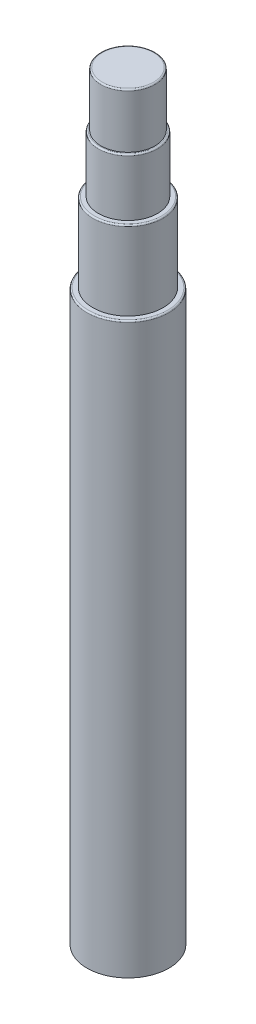
ISO-10303-21;
HEADER;
FILE_DESCRIPTION(('STEP AP214'),'2;1');
FILE_NAME('part.step','',(''),(''),'','','');
FILE_SCHEMA(('AUTOMOTIVE_DESIGN { 1 0 10303 214 1 1 1 1 }'));
ENDSEC;
DATA;
#1=APPLICATION_CONTEXT('core data for automotive mechanical design processes');
#2=APPLICATION_PROTOCOL_DEFINITION('international standard','automotive_design',2000,#1);
#3=PRODUCT_CONTEXT('',#1,'mechanical');
#4=PRODUCT('Part','Part','',(#3));
#5=PRODUCT_RELATED_PRODUCT_CATEGORY('part','',(#4));
#6=PRODUCT_DEFINITION_FORMATION('','',#4);
#7=PRODUCT_DEFINITION_CONTEXT('part definition',#1,'design');
#8=PRODUCT_DEFINITION('design','',#6,#7);
#9=PRODUCT_DEFINITION_SHAPE('','',#8);
#10=(LENGTH_UNIT() NAMED_UNIT(*) SI_UNIT(.MILLI.,.METRE.));
#11=(NAMED_UNIT(*) PLANE_ANGLE_UNIT() SI_UNIT($,.RADIAN.));
#12=(NAMED_UNIT(*) SI_UNIT($,.STERADIAN.) SOLID_ANGLE_UNIT());
#13=UNCERTAINTY_MEASURE_WITH_UNIT(LENGTH_MEASURE(1.E-05),#10,'distance_accuracy_value','');
#14=(GEOMETRIC_REPRESENTATION_CONTEXT(3) GLOBAL_UNCERTAINTY_ASSIGNED_CONTEXT((#13)) GLOBAL_UNIT_ASSIGNED_CONTEXT((#10,
#11,#12)) REPRESENTATION_CONTEXT('',''));
#15=CARTESIAN_POINT('',(0.,0.,0.));
#16=DIRECTION('',(0.,0.,1.));
#17=DIRECTION('',(1.,0.,0.));
#18=AXIS2_PLACEMENT_3D('',#15,#16,#17);
#19=CARTESIAN_POINT('',(0.,397.,0.));
#20=DIRECTION('',(0.,-1.,0.));
#21=DIRECTION('',(0.,0.,-1.));
#22=AXIS2_PLACEMENT_3D('',#19,#20,#21);
#23=CYLINDRICAL_SURFACE('',#22,28.575);
#24=CARTESIAN_POINT('',(0.,396.,0.));
#25=DIRECTION('',(0.,1.,0.));
#26=DIRECTION('',(0.,0.,1.));
#27=AXIS2_PLACEMENT_3D('',#24,#25,#26);
#28=CIRCLE('',#27,28.575);
#29=CARTESIAN_POINT('',(0.,396.,28.575));
#30=VERTEX_POINT('',#29);
#31=EDGE_CURVE('E79',#30,#30,#28,.F.);
#32=ORIENTED_EDGE('',*,*,#31,.T.);
#33=EDGE_LOOP('',(#32));
#34=FACE_BOUND('',#33,.T.);
#35=CARTESIAN_POINT('',(0.,0.,0.));
#36=DIRECTION('',(0.,1.,0.));
#37=DIRECTION('',(0.,0.,1.));
#38=AXIS2_PLACEMENT_3D('',#35,#36,#37);
#39=CIRCLE('',#38,28.575);
#40=CARTESIAN_POINT('',(0.,0.,28.575));
#41=VERTEX_POINT('',#40);
#42=EDGE_CURVE('E72',#41,#41,#39,.T.);
#43=ORIENTED_EDGE('',*,*,#42,.T.);
#44=EDGE_LOOP('',(#43));
#45=FACE_BOUND('',#44,.T.);
#46=ADVANCED_FACE('F41',(#34,#45),#23,.T.);
#47=CARTESIAN_POINT('',(0.,397.,0.));
#48=DIRECTION('',(0.,1.,0.));
#49=DIRECTION('',(0.,0.,1.));
#50=AXIS2_PLACEMENT_3D('',#47,#48,#49);
#51=PLANE('',#50);
#52=CARTESIAN_POINT('',(0.,397.,0.));
#53=DIRECTION('',(0.,1.,0.));
#54=DIRECTION('',(0.,0.,1.));
#55=AXIS2_PLACEMENT_3D('',#52,#53,#54);
#56=CIRCLE('',#55,27.575);
#57=CARTESIAN_POINT('',(0.,397.,27.575));
#58=VERTEX_POINT('',#57);
#59=EDGE_CURVE('E63',#58,#58,#56,.T.);
#60=ORIENTED_EDGE('',*,*,#59,.T.);
#61=EDGE_LOOP('',(#60));
#62=FACE_BOUND('',#61,.T.);
#63=CARTESIAN_POINT('',(0.,397.,0.));
#64=DIRECTION('',(0.,1.,0.));
#65=DIRECTION('',(0.,0.,1.));
#66=AXIS2_PLACEMENT_3D('',#63,#64,#65);
#67=CIRCLE('',#66,24.5);
#68=CARTESIAN_POINT('',(0.,397.,24.5));
#69=VERTEX_POINT('',#68);
#70=EDGE_CURVE('E68',#69,#69,#67,.T.);
#71=ORIENTED_EDGE('',*,*,#70,.F.);
#72=EDGE_LOOP('',(#71));
#73=FACE_BOUND('',#72,.T.);
#74=ADVANCED_FACE('F119',(#62,#73),#51,.T.);
#75=CARTESIAN_POINT('',(0.,0.,0.));
#76=DIRECTION('',(0.,1.,0.));
#77=DIRECTION('',(0.,0.,1.));
#78=AXIS2_PLACEMENT_3D('',#75,#76,#77);
#79=PLANE('',#78);
#80=CARTESIAN_POINT('',(0.,0.,0.));
#81=DIRECTION('',(0.,-1.,0.));
#82=DIRECTION('',(0.,0.,-1.));
#83=AXIS2_PLACEMENT_3D('',#80,#81,#82);
#84=CIRCLE('',#83,5.);
#85=CARTESIAN_POINT('',(0.,0.,-5.));
#86=VERTEX_POINT('',#85);
#87=EDGE_CURVE('E10',#86,#86,#84,.T.);
#88=ORIENTED_EDGE('',*,*,#87,.F.);
#89=EDGE_LOOP('',(#88));
#90=FACE_BOUND('',#89,.T.);
#91=ORIENTED_EDGE('',*,*,#42,.F.);
#92=EDGE_LOOP('',(#91));
#93=FACE_BOUND('',#92,.T.);
#94=ADVANCED_FACE('F125',(#90,#93),#79,.F.);
#95=CARTESIAN_POINT('',(0.,452.,0.));
#96=DIRECTION('',(0.,-1.,0.));
#97=DIRECTION('',(0.,0.,-1.));
#98=AXIS2_PLACEMENT_3D('',#95,#96,#97);
#99=CYLINDRICAL_SURFACE('',#98,24.5);
#100=CARTESIAN_POINT('',(0.,451.,0.));
#101=DIRECTION('',(0.,1.,0.));
#102=DIRECTION('',(0.,0.,1.));
#103=AXIS2_PLACEMENT_3D('',#100,#101,#102);
#104=CIRCLE('',#103,24.5);
#105=CARTESIAN_POINT('',(0.,451.,24.5));
#106=VERTEX_POINT('',#105);
#107=EDGE_CURVE('E87',#106,#106,#104,.F.);
#108=ORIENTED_EDGE('',*,*,#107,.T.);
#109=EDGE_LOOP('',(#108));
#110=FACE_BOUND('',#109,.T.);
#111=ORIENTED_EDGE('',*,*,#70,.T.);
#112=EDGE_LOOP('',(#111));
#113=FACE_BOUND('',#112,.T.);
#114=ADVANCED_FACE('F147',(#110,#113),#99,.T.);
#115=CARTESIAN_POINT('',(0.,452.,0.));
#116=DIRECTION('',(0.,1.,0.));
#117=DIRECTION('',(0.,0.,1.));
#118=AXIS2_PLACEMENT_3D('',#115,#116,#117);
#119=PLANE('',#118);
#120=CARTESIAN_POINT('',(0.,452.,0.));
#121=DIRECTION('',(0.,1.,0.));
#122=DIRECTION('',(0.,0.,1.));
#123=AXIS2_PLACEMENT_3D('',#120,#121,#122);
#124=CIRCLE('',#123,23.5);
#125=CARTESIAN_POINT('',(0.,452.,23.5));
#126=VERTEX_POINT('',#125);
#127=EDGE_CURVE('E83',#126,#126,#124,.T.);
#128=ORIENTED_EDGE('',*,*,#127,.T.);
#129=EDGE_LOOP('',(#128));
#130=FACE_BOUND('',#129,.T.);
#131=CARTESIAN_POINT('',(0.,452.,0.));
#132=DIRECTION('',(0.,1.,0.));
#133=DIRECTION('',(0.,0.,1.));
#134=AXIS2_PLACEMENT_3D('',#131,#132,#133);
#135=CIRCLE('',#134,20.64);
#136=CARTESIAN_POINT('',(0.,452.,20.64));
#137=VERTEX_POINT('',#136);
#138=EDGE_CURVE('E64',#137,#137,#135,.T.);
#139=ORIENTED_EDGE('',*,*,#138,.F.);
#140=EDGE_LOOP('',(#139));
#141=FACE_BOUND('',#140,.T.);
#142=ADVANCED_FACE('F143',(#130,#141),#119,.T.);
#143=CARTESIAN_POINT('',(0.,492.,0.));
#144=DIRECTION('',(0.,-1.,0.));
#145=DIRECTION('',(0.,0.,-1.));
#146=AXIS2_PLACEMENT_3D('',#143,#144,#145);
#147=CYLINDRICAL_SURFACE('',#146,20.64);
#148=CARTESIAN_POINT('',(0.,491.,0.));
#149=DIRECTION('',(0.,1.,0.));
#150=DIRECTION('',(0.,0.,1.));
#151=AXIS2_PLACEMENT_3D('',#148,#149,#150);
#152=CIRCLE('',#151,20.64);
#153=CARTESIAN_POINT('',(0.,491.,20.64));
#154=VERTEX_POINT('',#153);
#155=EDGE_CURVE('E95',#154,#154,#152,.F.);
#156=ORIENTED_EDGE('',*,*,#155,.T.);
#157=EDGE_LOOP('',(#156));
#158=FACE_BOUND('',#157,.T.);
#159=ORIENTED_EDGE('',*,*,#138,.T.);
#160=EDGE_LOOP('',(#159));
#161=FACE_BOUND('',#160,.T.);
#162=ADVANCED_FACE('F146',(#158,#161),#147,.T.);
#163=CARTESIAN_POINT('',(0.,492.,0.));
#164=DIRECTION('',(0.,1.,0.));
#165=DIRECTION('',(0.,0.,1.));
#166=AXIS2_PLACEMENT_3D('',#163,#164,#165);
#167=PLANE('',#166);
#168=CARTESIAN_POINT('',(0.,492.,0.));
#169=DIRECTION('',(0.,1.,0.));
#170=DIRECTION('',(0.,0.,1.));
#171=AXIS2_PLACEMENT_3D('',#168,#169,#170);
#172=CIRCLE('',#171,19.64);
#173=CARTESIAN_POINT('',(0.,492.,19.64));
#174=VERTEX_POINT('',#173);
#175=EDGE_CURVE('E91',#174,#174,#172,.T.);
#176=ORIENTED_EDGE('',*,*,#175,.T.);
#177=EDGE_LOOP('',(#176));
#178=FACE_BOUND('',#177,.T.);
#179=CARTESIAN_POINT('',(0.,492.,0.));
#180=DIRECTION('',(0.,1.,0.));
#181=DIRECTION('',(0.,0.,1.));
#182=AXIS2_PLACEMENT_3D('',#179,#180,#181);
#183=CIRCLE('',#182,18.9);
#184=CARTESIAN_POINT('',(0.,492.,18.9));
#185=VERTEX_POINT('',#184);
#186=EDGE_CURVE('E59',#185,#185,#183,.T.);
#187=ORIENTED_EDGE('',*,*,#186,.F.);
#188=EDGE_LOOP('',(#187));
#189=FACE_BOUND('',#188,.T.);
#190=ADVANCED_FACE('F152',(#178,#189),#167,.T.);
#191=CARTESIAN_POINT('',(0.,530.,0.));
#192=DIRECTION('',(0.,-1.,0.));
#193=DIRECTION('',(0.,0.,-1.));
#194=AXIS2_PLACEMENT_3D('',#191,#192,#193);
#195=CYLINDRICAL_SURFACE('',#194,18.9);
#196=CARTESIAN_POINT('',(0.,529.,0.));
#197=DIRECTION('',(0.,1.,0.));
#198=DIRECTION('',(0.,0.,1.));
#199=AXIS2_PLACEMENT_3D('',#196,#197,#198);
#200=CIRCLE('',#199,18.9);
#201=CARTESIAN_POINT('',(0.,529.,18.9));
#202=VERTEX_POINT('',#201);
#203=EDGE_CURVE('E45',#202,#202,#200,.F.);
#204=ORIENTED_EDGE('',*,*,#203,.T.);
#205=EDGE_LOOP('',(#204));
#206=FACE_BOUND('',#205,.T.);
#207=ORIENTED_EDGE('',*,*,#186,.T.);
#208=EDGE_LOOP('',(#207));
#209=FACE_BOUND('',#208,.T.);
#210=ADVANCED_FACE('F158',(#206,#209),#195,.T.);
#211=CARTESIAN_POINT('',(0.,530.,0.));
#212=DIRECTION('',(0.,1.,0.));
#213=DIRECTION('',(0.,0.,1.));
#214=AXIS2_PLACEMENT_3D('',#211,#212,#213);
#215=PLANE('',#214);
#216=CARTESIAN_POINT('',(0.,530.,0.));
#217=DIRECTION('',(0.,1.,0.));
#218=DIRECTION('',(0.,0.,1.));
#219=AXIS2_PLACEMENT_3D('',#216,#217,#218);
#220=CIRCLE('',#219,17.9);
#221=CARTESIAN_POINT('',(0.,530.,17.9));
#222=VERTEX_POINT('',#221);
#223=EDGE_CURVE('E55',#222,#222,#220,.T.);
#224=ORIENTED_EDGE('',*,*,#223,.T.);
#225=EDGE_LOOP('',(#224));
#226=FACE_BOUND('',#225,.T.);
#227=ADVANCED_FACE('F102',(#226),#215,.T.);
#228=CARTESIAN_POINT('',(0.,396.,0.));
#229=DIRECTION('',(0.,1.,0.));
#230=DIRECTION('',(0.,0.,1.));
#231=AXIS2_PLACEMENT_3D('',#228,#229,#230);
#232=TOROIDAL_SURFACE('',#231,27.575,1.);
#233=ORIENTED_EDGE('',*,*,#31,.F.);
#234=EDGE_LOOP('',(#233));
#235=FACE_BOUND('',#234,.T.);
#236=ORIENTED_EDGE('',*,*,#59,.F.);
#237=EDGE_LOOP('',(#236));
#238=FACE_BOUND('',#237,.T.);
#239=ADVANCED_FACE('F131',(#235,#238),#232,.T.);
#240=CARTESIAN_POINT('',(0.,451.,0.));
#241=DIRECTION('',(0.,1.,0.));
#242=DIRECTION('',(0.,0.,1.));
#243=AXIS2_PLACEMENT_3D('',#240,#241,#242);
#244=TOROIDAL_SURFACE('',#243,23.5,1.);
#245=ORIENTED_EDGE('',*,*,#107,.F.);
#246=EDGE_LOOP('',(#245));
#247=FACE_BOUND('',#246,.T.);
#248=ORIENTED_EDGE('',*,*,#127,.F.);
#249=EDGE_LOOP('',(#248));
#250=FACE_BOUND('',#249,.T.);
#251=ADVANCED_FACE('F115',(#247,#250),#244,.T.);
#252=CARTESIAN_POINT('',(0.,491.,0.));
#253=DIRECTION('',(0.,1.,0.));
#254=DIRECTION('',(0.,0.,1.));
#255=AXIS2_PLACEMENT_3D('',#252,#253,#254);
#256=TOROIDAL_SURFACE('',#255,19.64,1.);
#257=ORIENTED_EDGE('',*,*,#155,.F.);
#258=EDGE_LOOP('',(#257));
#259=FACE_BOUND('',#258,.T.);
#260=ORIENTED_EDGE('',*,*,#175,.F.);
#261=EDGE_LOOP('',(#260));
#262=FACE_BOUND('',#261,.T.);
#263=ADVANCED_FACE('F106',(#259,#262),#256,.T.);
#264=CARTESIAN_POINT('',(0.,529.,0.));
#265=DIRECTION('',(0.,1.,0.));
#266=DIRECTION('',(0.,0.,1.));
#267=AXIS2_PLACEMENT_3D('',#264,#265,#266);
#268=TOROIDAL_SURFACE('',#267,17.9,1.);
#269=ORIENTED_EDGE('',*,*,#203,.F.);
#270=EDGE_LOOP('',(#269));
#271=FACE_BOUND('',#270,.T.);
#272=ORIENTED_EDGE('',*,*,#223,.F.);
#273=EDGE_LOOP('',(#272));
#274=FACE_BOUND('',#273,.T.);
#275=ADVANCED_FACE('F43',(#271,#274),#268,.T.);
#276=CARTESIAN_POINT('',(0.,-5.,0.));
#277=DIRECTION('',(0.,1.,0.));
#278=DIRECTION('',(0.,0.,1.));
#279=AXIS2_PLACEMENT_3D('',#276,#277,#278);
#280=CYLINDRICAL_SURFACE('',#279,5.);
#281=CARTESIAN_POINT('',(0.,-5.,0.));
#282=DIRECTION('',(0.,-1.,0.));
#283=DIRECTION('',(0.,0.,-1.));
#284=AXIS2_PLACEMENT_3D('',#281,#282,#283);
#285=CIRCLE('',#284,5.);
#286=CARTESIAN_POINT('',(0.,-5.,-5.));
#287=VERTEX_POINT('',#286);
#288=EDGE_CURVE('E58',#287,#287,#285,.T.);
#289=ORIENTED_EDGE('',*,*,#288,.F.);
#290=EDGE_LOOP('',(#289));
#291=FACE_BOUND('',#290,.T.);
#292=ORIENTED_EDGE('',*,*,#87,.T.);
#293=EDGE_LOOP('',(#292));
#294=FACE_BOUND('',#293,.T.);
#295=ADVANCED_FACE('F105',(#291,#294),#280,.T.);
#296=CARTESIAN_POINT('',(0.,-5.,0.));
#297=DIRECTION('',(0.,-1.,0.));
#298=DIRECTION('',(0.,0.,-1.));
#299=AXIS2_PLACEMENT_3D('',#296,#297,#298);
#300=PLANE('',#299);
#301=ORIENTED_EDGE('',*,*,#288,.T.);
#302=EDGE_LOOP('',(#301));
#303=FACE_BOUND('',#302,.T.);
#304=ADVANCED_FACE('F112',(#303),#300,.T.);
#305=CLOSED_SHELL('',(#46,#74,#94,#114,#142,#162,#190,#210,#227,#239,#251,#263,#275,#295,#304));
#306=MANIFOLD_SOLID_BREP('B2',#305);
#307=ADVANCED_BREP_SHAPE_REPRESENTATION('',(#18,#306),#14);
#308=SHAPE_DEFINITION_REPRESENTATION(#9,#307);
ENDSEC;
END-ISO-10303-21;
